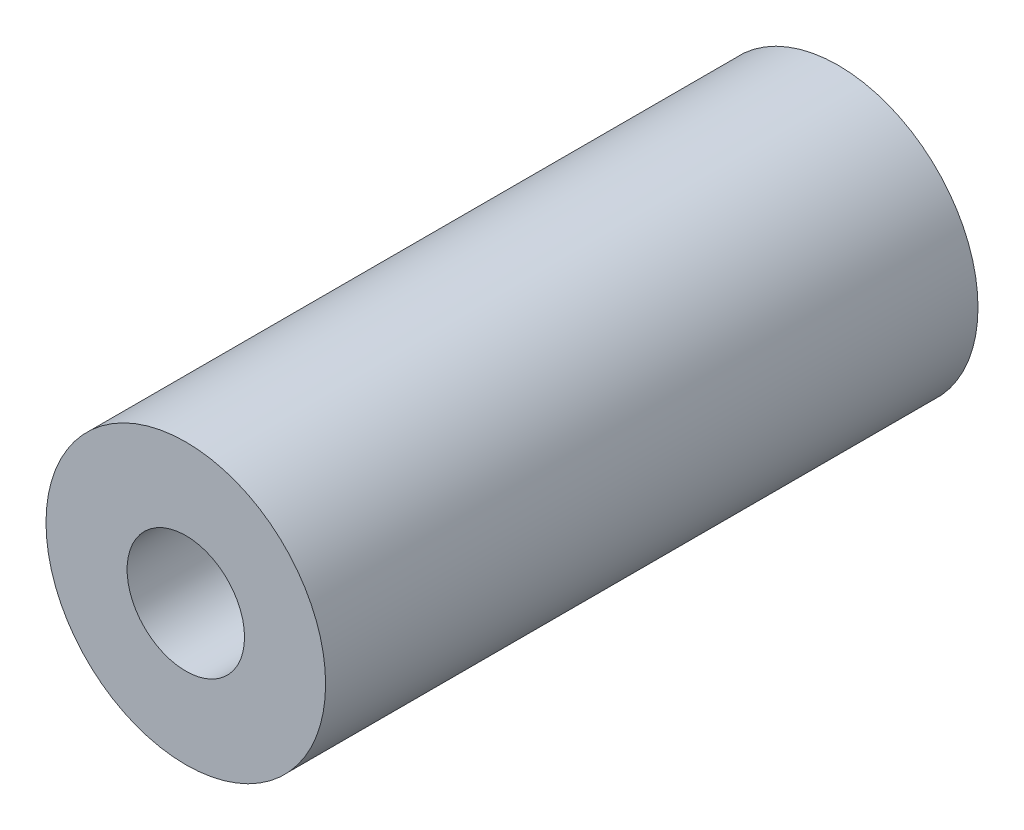
ISO-10303-21;
HEADER;
FILE_DESCRIPTION(('STEP AP214'),'2;1');
FILE_NAME('part.step','',(''),(''),'','','');
FILE_SCHEMA(('AUTOMOTIVE_DESIGN { 1 0 10303 214 1 1 1 1 }'));
ENDSEC;
DATA;
#1=APPLICATION_CONTEXT('core data for automotive mechanical design processes');
#2=APPLICATION_PROTOCOL_DEFINITION('international standard','automotive_design',2000,#1);
#3=PRODUCT_CONTEXT('',#1,'mechanical');
#4=PRODUCT('Part','Part','',(#3));
#5=PRODUCT_RELATED_PRODUCT_CATEGORY('part','',(#4));
#6=PRODUCT_DEFINITION_FORMATION('','',#4);
#7=PRODUCT_DEFINITION_CONTEXT('part definition',#1,'design');
#8=PRODUCT_DEFINITION('design','',#6,#7);
#9=PRODUCT_DEFINITION_SHAPE('','',#8);
#10=(LENGTH_UNIT() NAMED_UNIT(*) SI_UNIT(.MILLI.,.METRE.));
#11=(NAMED_UNIT(*) PLANE_ANGLE_UNIT() SI_UNIT($,.RADIAN.));
#12=(NAMED_UNIT(*) SI_UNIT($,.STERADIAN.) SOLID_ANGLE_UNIT());
#13=UNCERTAINTY_MEASURE_WITH_UNIT(LENGTH_MEASURE(1.E-05),#10,'distance_accuracy_value','');
#14=(GEOMETRIC_REPRESENTATION_CONTEXT(3) GLOBAL_UNCERTAINTY_ASSIGNED_CONTEXT((#13)) GLOBAL_UNIT_ASSIGNED_CONTEXT((#10,
#11,#12)) REPRESENTATION_CONTEXT('',''));
#15=CARTESIAN_POINT('',(0.,0.,0.));
#16=DIRECTION('',(0.,0.,1.));
#17=DIRECTION('',(1.,0.,0.));
#18=AXIS2_PLACEMENT_3D('',#15,#16,#17);
#19=CARTESIAN_POINT('',(0.,0.,22.225));
#20=DIRECTION('',(0.,0.,1.));
#21=DIRECTION('',(1.,0.,0.));
#22=AXIS2_PLACEMENT_3D('',#19,#20,#21);
#23=PLANE('',#22);
#24=CARTESIAN_POINT('',(0.,0.,22.225));
#25=DIRECTION('',(0.,0.,1.));
#26=DIRECTION('',(1.,0.,0.));
#27=AXIS2_PLACEMENT_3D('',#24,#25,#26);
#28=CIRCLE('',#27,9.525);
#29=CARTESIAN_POINT('',(9.525,0.,22.225));
#30=VERTEX_POINT('',#29);
#31=EDGE_CURVE('E10',#30,#30,#28,.T.);
#32=ORIENTED_EDGE('',*,*,#31,.T.);
#33=EDGE_LOOP('',(#32));
#34=FACE_BOUND('',#33,.T.);
#35=CARTESIAN_POINT('',(0.,0.,22.225));
#36=DIRECTION('',(0.,0.,1.));
#37=DIRECTION('',(1.,0.,0.));
#38=AXIS2_PLACEMENT_3D('',#35,#36,#37);
#39=CIRCLE('',#38,4.0005);
#40=CARTESIAN_POINT('',(4.0005,0.,22.225));
#41=VERTEX_POINT('',#40);
#42=EDGE_CURVE('E58',#41,#41,#39,.T.);
#43=ORIENTED_EDGE('',*,*,#42,.F.);
#44=EDGE_LOOP('',(#43));
#45=FACE_BOUND('',#44,.T.);
#46=ADVANCED_FACE('F44',(#34,#45),#23,.T.);
#47=CARTESIAN_POINT('',(0.,0.,-22.225));
#48=DIRECTION('',(0.,0.,1.));
#49=DIRECTION('',(1.,0.,0.));
#50=AXIS2_PLACEMENT_3D('',#47,#48,#49);
#51=PLANE('',#50);
#52=CARTESIAN_POINT('',(0.,0.,-22.225));
#53=DIRECTION('',(0.,0.,1.));
#54=DIRECTION('',(1.,0.,0.));
#55=AXIS2_PLACEMENT_3D('',#52,#53,#54);
#56=CIRCLE('',#55,9.525);
#57=CARTESIAN_POINT('',(9.525,0.,-22.225));
#58=VERTEX_POINT('',#57);
#59=EDGE_CURVE('E48',#58,#58,#56,.T.);
#60=ORIENTED_EDGE('',*,*,#59,.F.);
#61=EDGE_LOOP('',(#60));
#62=FACE_BOUND('',#61,.T.);
#63=CARTESIAN_POINT('',(0.,0.,-22.225));
#64=DIRECTION('',(0.,0.,1.));
#65=DIRECTION('',(1.,0.,0.));
#66=AXIS2_PLACEMENT_3D('',#63,#64,#65);
#67=CIRCLE('',#66,4.0005);
#68=CARTESIAN_POINT('',(4.0005,0.,-22.225));
#69=VERTEX_POINT('',#68);
#70=EDGE_CURVE('E60',#69,#69,#67,.T.);
#71=ORIENTED_EDGE('',*,*,#70,.T.);
#72=EDGE_LOOP('',(#71));
#73=FACE_BOUND('',#72,.T.);
#74=ADVANCED_FACE('F73',(#62,#73),#51,.F.);
#75=CARTESIAN_POINT('',(0.,0.,22.225));
#76=DIRECTION('',(0.,0.,-1.));
#77=DIRECTION('',(-1.,0.,0.));
#78=AXIS2_PLACEMENT_3D('',#75,#76,#77);
#79=CYLINDRICAL_SURFACE('',#78,9.525);
#80=ORIENTED_EDGE('',*,*,#31,.F.);
#81=EDGE_LOOP('',(#80));
#82=FACE_BOUND('',#81,.T.);
#83=ORIENTED_EDGE('',*,*,#59,.T.);
#84=EDGE_LOOP('',(#83));
#85=FACE_BOUND('',#84,.T.);
#86=ADVANCED_FACE('F46',(#82,#85),#79,.T.);
#87=CARTESIAN_POINT('',(0.,0.,22.225));
#88=DIRECTION('',(0.,0.,-1.));
#89=DIRECTION('',(-1.,0.,0.));
#90=AXIS2_PLACEMENT_3D('',#87,#88,#89);
#91=CYLINDRICAL_SURFACE('',#90,4.0005);
#92=ORIENTED_EDGE('',*,*,#42,.T.);
#93=EDGE_LOOP('',(#92));
#94=FACE_BOUND('',#93,.T.);
#95=ORIENTED_EDGE('',*,*,#70,.F.);
#96=EDGE_LOOP('',(#95));
#97=FACE_BOUND('',#96,.T.);
#98=ADVANCED_FACE('F69',(#94,#97),#91,.F.);
#99=CLOSED_SHELL('',(#46,#74,#86,#98));
#100=MANIFOLD_SOLID_BREP('B2',#99);
#101=ADVANCED_BREP_SHAPE_REPRESENTATION('',(#18,#100),#14);
#102=SHAPE_DEFINITION_REPRESENTATION(#9,#101);
ENDSEC;
END-ISO-10303-21;
